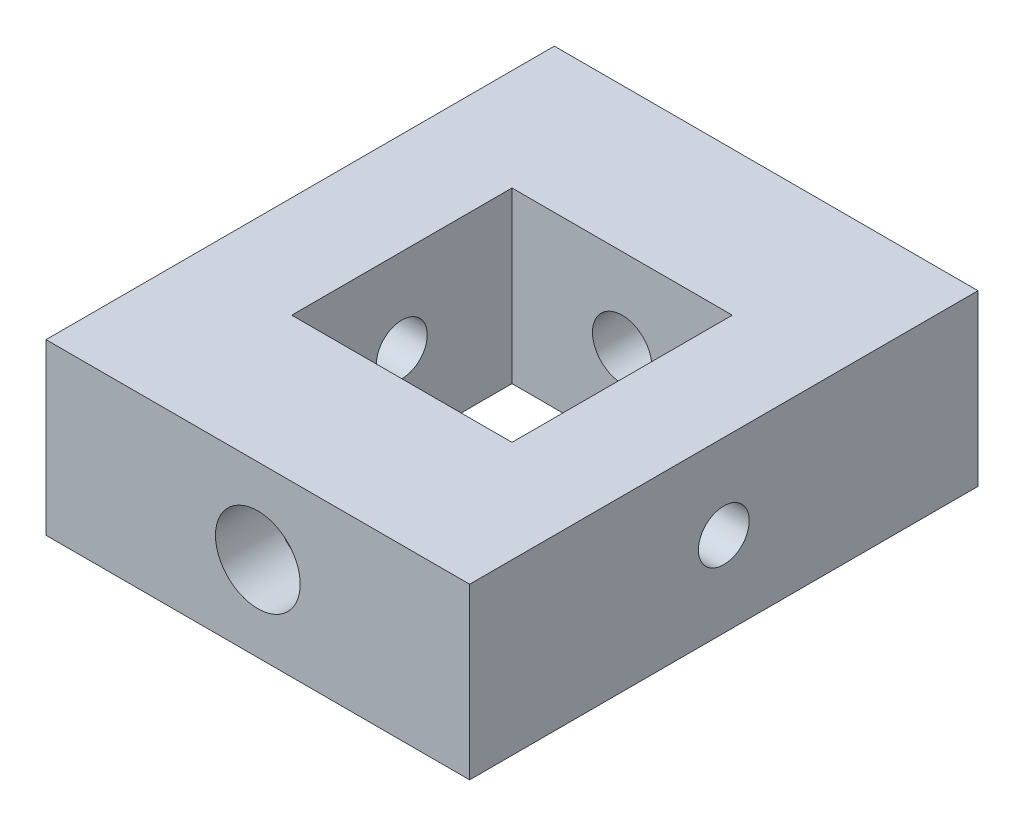
ISO-10303-21;
HEADER;
FILE_DESCRIPTION(('STEP AP214'),'2;1');
FILE_NAME('part.step','',(''),(''),'','','');
FILE_SCHEMA(('AUTOMOTIVE_DESIGN { 1 0 10303 214 1 1 1 1 }'));
ENDSEC;
DATA;
#1=APPLICATION_CONTEXT('core data for automotive mechanical design processes');
#2=APPLICATION_PROTOCOL_DEFINITION('international standard','automotive_design',2000,#1);
#3=PRODUCT_CONTEXT('',#1,'mechanical');
#4=PRODUCT('Part','Part','',(#3));
#5=PRODUCT_RELATED_PRODUCT_CATEGORY('part','',(#4));
#6=PRODUCT_DEFINITION_FORMATION('','',#4);
#7=PRODUCT_DEFINITION_CONTEXT('part definition',#1,'design');
#8=PRODUCT_DEFINITION('design','',#6,#7);
#9=PRODUCT_DEFINITION_SHAPE('','',#8);
#10=(LENGTH_UNIT() NAMED_UNIT(*) SI_UNIT(.MILLI.,.METRE.));
#11=(NAMED_UNIT(*) PLANE_ANGLE_UNIT() SI_UNIT($,.RADIAN.));
#12=(NAMED_UNIT(*) SI_UNIT($,.STERADIAN.) SOLID_ANGLE_UNIT());
#13=UNCERTAINTY_MEASURE_WITH_UNIT(LENGTH_MEASURE(1.E-05),#10,'distance_accuracy_value','');
#14=(GEOMETRIC_REPRESENTATION_CONTEXT(3) GLOBAL_UNCERTAINTY_ASSIGNED_CONTEXT((#13)) GLOBAL_UNIT_ASSIGNED_CONTEXT((#10,
#11,#12)) REPRESENTATION_CONTEXT('',''));
#15=CARTESIAN_POINT('',(0.,0.,0.));
#16=DIRECTION('',(0.,0.,1.));
#17=DIRECTION('',(1.,0.,0.));
#18=AXIS2_PLACEMENT_3D('',#15,#16,#17);
#19=CARTESIAN_POINT('',(2.25514051876985E-13,2.000000000001,6.));
#20=DIRECTION('',(0.,0.,-1.));
#21=DIRECTION('',(-1.,0.,0.));
#22=AXIS2_PLACEMENT_3D('',#19,#20,#21);
#23=CYLINDRICAL_SURFACE('',#22,0.7);
#24=CARTESIAN_POINT('',(2.25514051876985E-13,2.000000000001,-2.6));
#25=DIRECTION('',(0.,0.,-1.));
#26=DIRECTION('',(-1.,0.,0.));
#27=AXIS2_PLACEMENT_3D('',#24,#25,#26);
#28=CIRCLE('',#27,0.7);
#29=CARTESIAN_POINT('',(-0.699999999999774,2.000000000001,-2.6));
#30=VERTEX_POINT('',#29);
#31=EDGE_CURVE('E195',#30,#30,#28,.T.);
#32=ORIENTED_EDGE('',*,*,#31,.F.);
#33=EDGE_LOOP('',(#32));
#34=FACE_BOUND('',#33,.T.);
#35=CARTESIAN_POINT('',(2.25514051876985E-13,2.000000000001,-4.6));
#36=DIRECTION('',(0.,0.,-1.));
#37=DIRECTION('',(-1.,0.,0.));
#38=AXIS2_PLACEMENT_3D('',#35,#36,#37);
#39=CIRCLE('',#38,0.7);
#40=CARTESIAN_POINT('',(-0.699999999999774,2.000000000001,-4.6));
#41=VERTEX_POINT('',#40);
#42=EDGE_CURVE('E198',#41,#41,#39,.F.);
#43=ORIENTED_EDGE('',*,*,#42,.F.);
#44=EDGE_LOOP('',(#43));
#45=FACE_BOUND('',#44,.T.);
#46=ADVANCED_FACE('F61',(#34,#45),#23,.F.);
#47=CARTESIAN_POINT('',(-5.,4.,6.));
#48=DIRECTION('',(-1.,0.,0.));
#49=DIRECTION('',(0.,0.,1.));
#50=AXIS2_PLACEMENT_3D('',#47,#48,#49);
#51=PLANE('',#50);
#52=CARTESIAN_POINT('',(-5.,1.99999999999944,0.));
#53=DIRECTION('',(1.,0.,0.));
#54=DIRECTION('',(0.,0.,-1.));
#55=AXIS2_PLACEMENT_3D('',#52,#53,#54);
#56=CIRCLE('',#55,0.6);
#57=CARTESIAN_POINT('',(-5.,1.99999999999944,-0.599999999999986));
#58=VERTEX_POINT('',#57);
#59=EDGE_CURVE('E194',#58,#58,#56,.T.);
#60=ORIENTED_EDGE('',*,*,#59,.T.);
#61=EDGE_LOOP('',(#60));
#62=FACE_BOUND('',#61,.T.);
#63=DIRECTION('',(0.,0.,-1.));
#64=VECTOR('',#63,1.);
#65=CARTESIAN_POINT('',(-5.,0.,6.));
#66=LINE('',#65,#64);
#67=CARTESIAN_POINT('',(-5.,0.,6.));
#68=VERTEX_POINT('',#67);
#69=CARTESIAN_POINT('',(-5.,0.,-6.));
#70=VERTEX_POINT('',#69);
#71=EDGE_CURVE('E161',#68,#70,#66,.T.);
#72=ORIENTED_EDGE('',*,*,#71,.F.);
#73=DIRECTION('',(0.,-1.,0.));
#74=VECTOR('',#73,1.);
#75=CARTESIAN_POINT('',(-5.,4.,6.));
#76=LINE('',#75,#74);
#77=CARTESIAN_POINT('',(-5.,4.,6.));
#78=VERTEX_POINT('',#77);
#79=EDGE_CURVE('E13',#78,#68,#76,.T.);
#80=ORIENTED_EDGE('',*,*,#79,.F.);
#81=DIRECTION('',(0.,0.,-1.));
#82=VECTOR('',#81,1.);
#83=CARTESIAN_POINT('',(-5.,4.,6.));
#84=LINE('',#83,#82);
#85=CARTESIAN_POINT('',(-5.,4.,-6.));
#86=VERTEX_POINT('',#85);
#87=EDGE_CURVE('E165',#78,#86,#84,.T.);
#88=ORIENTED_EDGE('',*,*,#87,.T.);
#89=DIRECTION('',(0.,-1.,0.));
#90=VECTOR('',#89,1.);
#91=CARTESIAN_POINT('',(-5.,4.,-6.));
#92=LINE('',#91,#90);
#93=EDGE_CURVE('E176',#86,#70,#92,.T.);
#94=ORIENTED_EDGE('',*,*,#93,.T.);
#95=EDGE_LOOP('',(#72,#80,#88,#94));
#96=FACE_BOUND('',#95,.T.);
#97=ADVANCED_FACE('F63',(#62,#96),#51,.T.);
#98=CARTESIAN_POINT('',(-5.,4.,6.));
#99=DIRECTION('',(0.,0.,-1.));
#100=DIRECTION('',(-1.,0.,0.));
#101=AXIS2_PLACEMENT_3D('',#98,#99,#100);
#102=PLANE('',#101);
#103=CARTESIAN_POINT('',(2.25514051876985E-13,2.000000000001,6.));
#104=DIRECTION('',(0.,0.,-1.));
#105=DIRECTION('',(-1.,0.,0.));
#106=AXIS2_PLACEMENT_3D('',#103,#104,#105);
#107=CIRCLE('',#106,1.);
#108=CARTESIAN_POINT('',(-0.999999999999774,2.000000000001,6.));
#109=VERTEX_POINT('',#108);
#110=EDGE_CURVE('E392',#109,#109,#107,.T.);
#111=ORIENTED_EDGE('',*,*,#110,.T.);
#112=EDGE_LOOP('',(#111));
#113=FACE_BOUND('',#112,.T.);
#114=DIRECTION('',(1.,0.,0.));
#115=VECTOR('',#114,1.);
#116=CARTESIAN_POINT('',(-5.,0.,6.));
#117=LINE('',#116,#115);
#118=CARTESIAN_POINT('',(5.,0.,6.));
#119=VERTEX_POINT('',#118);
#120=EDGE_CURVE('E169',#68,#119,#117,.T.);
#121=ORIENTED_EDGE('',*,*,#120,.T.);
#122=DIRECTION('',(0.,-1.,0.));
#123=VECTOR('',#122,1.);
#124=CARTESIAN_POINT('',(5.,4.,6.));
#125=LINE('',#124,#123);
#126=CARTESIAN_POINT('',(5.,4.,6.));
#127=VERTEX_POINT('',#126);
#128=EDGE_CURVE('E70',#127,#119,#125,.T.);
#129=ORIENTED_EDGE('',*,*,#128,.F.);
#130=DIRECTION('',(1.,0.,0.));
#131=VECTOR('',#130,1.);
#132=CARTESIAN_POINT('',(-5.,4.,6.));
#133=LINE('',#132,#131);
#134=EDGE_CURVE('E174',#78,#127,#133,.T.);
#135=ORIENTED_EDGE('',*,*,#134,.F.);
#136=ORIENTED_EDGE('',*,*,#79,.T.);
#137=EDGE_LOOP('',(#121,#129,#135,#136));
#138=FACE_BOUND('',#137,.T.);
#139=ADVANCED_FACE('F225',(#113,#138),#102,.F.);
#140=CARTESIAN_POINT('',(5.,4.,6.));
#141=DIRECTION('',(-1.,0.,0.));
#142=DIRECTION('',(0.,0.,1.));
#143=AXIS2_PLACEMENT_3D('',#140,#141,#142);
#144=PLANE('',#143);
#145=CARTESIAN_POINT('',(5.,1.99999999999944,0.));
#146=DIRECTION('',(1.,0.,0.));
#147=DIRECTION('',(0.,0.,-1.));
#148=AXIS2_PLACEMENT_3D('',#145,#146,#147);
#149=CIRCLE('',#148,0.6);
#150=CARTESIAN_POINT('',(5.,1.99999999999944,-0.599999999999986));
#151=VERTEX_POINT('',#150);
#152=EDGE_CURVE('E214',#151,#151,#149,.T.);
#153=ORIENTED_EDGE('',*,*,#152,.F.);
#154=EDGE_LOOP('',(#153));
#155=FACE_BOUND('',#154,.T.);
#156=DIRECTION('',(0.,0.,-1.));
#157=VECTOR('',#156,1.);
#158=CARTESIAN_POINT('',(5.,0.,6.));
#159=LINE('',#158,#157);
#160=CARTESIAN_POINT('',(5.,0.,-6.));
#161=VERTEX_POINT('',#160);
#162=EDGE_CURVE('E182',#119,#161,#159,.T.);
#163=ORIENTED_EDGE('',*,*,#162,.T.);
#164=DIRECTION('',(0.,-1.,0.));
#165=VECTOR('',#164,1.);
#166=CARTESIAN_POINT('',(5.,4.,-6.));
#167=LINE('',#166,#165);
#168=CARTESIAN_POINT('',(5.,4.,-6.));
#169=VERTEX_POINT('',#168);
#170=EDGE_CURVE('E188',#169,#161,#167,.T.);
#171=ORIENTED_EDGE('',*,*,#170,.F.);
#172=DIRECTION('',(0.,0.,-1.));
#173=VECTOR('',#172,1.);
#174=CARTESIAN_POINT('',(5.,4.,6.));
#175=LINE('',#174,#173);
#176=EDGE_CURVE('E172',#127,#169,#175,.T.);
#177=ORIENTED_EDGE('',*,*,#176,.F.);
#178=ORIENTED_EDGE('',*,*,#128,.T.);
#179=EDGE_LOOP('',(#163,#171,#177,#178));
#180=FACE_BOUND('',#179,.T.);
#181=ADVANCED_FACE('F221',(#155,#180),#144,.F.);
#182=CARTESIAN_POINT('',(-5.,4.,-6.));
#183=DIRECTION('',(0.,0.,-1.));
#184=DIRECTION('',(-1.,0.,0.));
#185=AXIS2_PLACEMENT_3D('',#182,#183,#184);
#186=PLANE('',#185);
#187=CARTESIAN_POINT('',(2.25514051876985E-13,2.000000000001,-6.));
#188=DIRECTION('',(0.,0.,-1.));
#189=DIRECTION('',(-1.,0.,0.));
#190=AXIS2_PLACEMENT_3D('',#187,#188,#189);
#191=CIRCLE('',#190,1.);
#192=CARTESIAN_POINT('',(-0.999999999999774,2.000000000001,-6.));
#193=VERTEX_POINT('',#192);
#194=EDGE_CURVE('E204',#193,#193,#191,.T.);
#195=ORIENTED_EDGE('',*,*,#194,.F.);
#196=EDGE_LOOP('',(#195));
#197=FACE_BOUND('',#196,.T.);
#198=DIRECTION('',(1.,0.,0.));
#199=VECTOR('',#198,1.);
#200=CARTESIAN_POINT('',(-5.,0.,-6.));
#201=LINE('',#200,#199);
#202=EDGE_CURVE('E179',#70,#161,#201,.T.);
#203=ORIENTED_EDGE('',*,*,#202,.F.);
#204=ORIENTED_EDGE('',*,*,#93,.F.);
#205=DIRECTION('',(1.,0.,0.));
#206=VECTOR('',#205,1.);
#207=CARTESIAN_POINT('',(-5.,4.,-6.));
#208=LINE('',#207,#206);
#209=EDGE_CURVE('E168',#86,#169,#208,.T.);
#210=ORIENTED_EDGE('',*,*,#209,.T.);
#211=ORIENTED_EDGE('',*,*,#170,.T.);
#212=EDGE_LOOP('',(#203,#204,#210,#211));
#213=FACE_BOUND('',#212,.T.);
#214=ADVANCED_FACE('F224',(#197,#213),#186,.T.);
#215=CARTESIAN_POINT('',(0.,4.,0.));
#216=DIRECTION('',(0.,-1.,0.));
#217=DIRECTION('',(0.,0.,-1.));
#218=AXIS2_PLACEMENT_3D('',#215,#216,#217);
#219=PLANE('',#218);
#220=DIRECTION('',(1.,0.,0.));
#221=VECTOR('',#220,1.);
#222=CARTESIAN_POINT('',(-2.6,4.,2.6));
#223=LINE('',#222,#221);
#224=CARTESIAN_POINT('',(-2.6,4.,2.6));
#225=VERTEX_POINT('',#224);
#226=CARTESIAN_POINT('',(2.6,4.,2.6));
#227=VERTEX_POINT('',#226);
#228=EDGE_CURVE('E132',#225,#227,#223,.T.);
#229=ORIENTED_EDGE('',*,*,#228,.F.);
#230=DIRECTION('',(0.,0.,-1.));
#231=VECTOR('',#230,1.);
#232=CARTESIAN_POINT('',(-2.6,4.,2.6));
#233=LINE('',#232,#231);
#234=CARTESIAN_POINT('',(-2.6,4.,-2.6));
#235=VERTEX_POINT('',#234);
#236=EDGE_CURVE('E129',#225,#235,#233,.T.);
#237=ORIENTED_EDGE('',*,*,#236,.T.);
#238=DIRECTION('',(1.,0.,0.));
#239=VECTOR('',#238,1.);
#240=CARTESIAN_POINT('',(-2.6,4.,-2.6));
#241=LINE('',#240,#239);
#242=CARTESIAN_POINT('',(2.6,4.,-2.6));
#243=VERTEX_POINT('',#242);
#244=EDGE_CURVE('E135',#235,#243,#241,.T.);
#245=ORIENTED_EDGE('',*,*,#244,.T.);
#246=DIRECTION('',(0.,0.,-1.));
#247=VECTOR('',#246,1.);
#248=CARTESIAN_POINT('',(2.6,4.,2.6));
#249=LINE('',#248,#247);
#250=EDGE_CURVE('E139',#227,#243,#249,.T.);
#251=ORIENTED_EDGE('',*,*,#250,.F.);
#252=EDGE_LOOP('',(#229,#237,#245,#251));
#253=FACE_BOUND('',#252,.T.);
#254=ORIENTED_EDGE('',*,*,#87,.F.);
#255=ORIENTED_EDGE('',*,*,#134,.T.);
#256=ORIENTED_EDGE('',*,*,#176,.T.);
#257=ORIENTED_EDGE('',*,*,#209,.F.);
#258=EDGE_LOOP('',(#254,#255,#256,#257));
#259=FACE_BOUND('',#258,.T.);
#260=ADVANCED_FACE('F141',(#253,#259),#219,.F.);
#261=CARTESIAN_POINT('',(0.,0.,0.));
#262=DIRECTION('',(0.,-1.,0.));
#263=DIRECTION('',(0.,0.,-1.));
#264=AXIS2_PLACEMENT_3D('',#261,#262,#263);
#265=PLANE('',#264);
#266=DIRECTION('',(0.,0.,-1.));
#267=VECTOR('',#266,1.);
#268=CARTESIAN_POINT('',(-2.6,0.,2.6));
#269=LINE('',#268,#267);
#270=CARTESIAN_POINT('',(-2.6,0.,2.6));
#271=VERTEX_POINT('',#270);
#272=CARTESIAN_POINT('',(-2.6,0.,-2.6));
#273=VERTEX_POINT('',#272);
#274=EDGE_CURVE('E86',#271,#273,#269,.T.);
#275=ORIENTED_EDGE('',*,*,#274,.F.);
#276=DIRECTION('',(1.,0.,0.));
#277=VECTOR('',#276,1.);
#278=CARTESIAN_POINT('',(-2.6,0.,2.6));
#279=LINE('',#278,#277);
#280=CARTESIAN_POINT('',(2.6,0.,2.6));
#281=VERTEX_POINT('',#280);
#282=EDGE_CURVE('E143',#271,#281,#279,.T.);
#283=ORIENTED_EDGE('',*,*,#282,.T.);
#284=DIRECTION('',(0.,0.,-1.));
#285=VECTOR('',#284,1.);
#286=CARTESIAN_POINT('',(2.6,0.,2.6));
#287=LINE('',#286,#285);
#288=CARTESIAN_POINT('',(2.6,0.,-2.6));
#289=VERTEX_POINT('',#288);
#290=EDGE_CURVE('E146',#281,#289,#287,.T.);
#291=ORIENTED_EDGE('',*,*,#290,.T.);
#292=DIRECTION('',(1.,0.,0.));
#293=VECTOR('',#292,1.);
#294=CARTESIAN_POINT('',(-2.6,0.,-2.6));
#295=LINE('',#294,#293);
#296=EDGE_CURVE('E155',#273,#289,#295,.T.);
#297=ORIENTED_EDGE('',*,*,#296,.F.);
#298=EDGE_LOOP('',(#275,#283,#291,#297));
#299=FACE_BOUND('',#298,.T.);
#300=ORIENTED_EDGE('',*,*,#71,.T.);
#301=ORIENTED_EDGE('',*,*,#202,.T.);
#302=ORIENTED_EDGE('',*,*,#162,.F.);
#303=ORIENTED_EDGE('',*,*,#120,.F.);
#304=EDGE_LOOP('',(#300,#301,#302,#303));
#305=FACE_BOUND('',#304,.T.);
#306=ADVANCED_FACE('F234',(#299,#305),#265,.T.);
#307=CARTESIAN_POINT('',(-2.6,4.,2.6));
#308=DIRECTION('',(-1.,0.,0.));
#309=DIRECTION('',(0.,0.,1.));
#310=AXIS2_PLACEMENT_3D('',#307,#308,#309);
#311=PLANE('',#310);
#312=CARTESIAN_POINT('',(-2.6,1.99999999999944,0.));
#313=DIRECTION('',(-1.,0.,0.));
#314=DIRECTION('',(0.,0.,1.));
#315=AXIS2_PLACEMENT_3D('',#312,#313,#314);
#316=CIRCLE('',#315,0.6);
#317=CARTESIAN_POINT('',(-2.6,1.99999999999944,0.600000000000013));
#318=VERTEX_POINT('',#317);
#319=EDGE_CURVE('E149',#318,#318,#316,.T.);
#320=ORIENTED_EDGE('',*,*,#319,.T.);
#321=EDGE_LOOP('',(#320));
#322=FACE_BOUND('',#321,.T.);
#323=ORIENTED_EDGE('',*,*,#274,.T.);
#324=DIRECTION('',(0.,-1.,0.));
#325=VECTOR('',#324,1.);
#326=CARTESIAN_POINT('',(-2.6,4.,-2.6));
#327=LINE('',#326,#325);
#328=EDGE_CURVE('E126',#235,#273,#327,.T.);
#329=ORIENTED_EDGE('',*,*,#328,.F.);
#330=ORIENTED_EDGE('',*,*,#236,.F.);
#331=DIRECTION('',(0.,-1.,0.));
#332=VECTOR('',#331,1.);
#333=CARTESIAN_POINT('',(-2.6,4.,2.6));
#334=LINE('',#333,#332);
#335=EDGE_CURVE('E159',#225,#271,#334,.T.);
#336=ORIENTED_EDGE('',*,*,#335,.T.);
#337=EDGE_LOOP('',(#323,#329,#330,#336));
#338=FACE_BOUND('',#337,.T.);
#339=ADVANCED_FACE('F127',(#322,#338),#311,.F.);
#340=CARTESIAN_POINT('',(-2.6,4.,2.6));
#341=DIRECTION('',(0.,0.,-1.));
#342=DIRECTION('',(-1.,0.,0.));
#343=AXIS2_PLACEMENT_3D('',#340,#341,#342);
#344=PLANE('',#343);
#345=CARTESIAN_POINT('',(2.25514051876985E-13,2.000000000001,2.6));
#346=DIRECTION('',(0.,0.,-1.));
#347=DIRECTION('',(-1.,0.,0.));
#348=AXIS2_PLACEMENT_3D('',#345,#346,#347);
#349=CIRCLE('',#348,0.7);
#350=CARTESIAN_POINT('',(-0.699999999999774,2.000000000001,2.6));
#351=VERTEX_POINT('',#350);
#352=EDGE_CURVE('E197',#351,#351,#349,.T.);
#353=ORIENTED_EDGE('',*,*,#352,.F.);
#354=EDGE_LOOP('',(#353));
#355=FACE_BOUND('',#354,.T.);
#356=ORIENTED_EDGE('',*,*,#282,.F.);
#357=ORIENTED_EDGE('',*,*,#335,.F.);
#358=ORIENTED_EDGE('',*,*,#228,.T.);
#359=DIRECTION('',(0.,-1.,0.));
#360=VECTOR('',#359,1.);
#361=CARTESIAN_POINT('',(2.6,4.,2.6));
#362=LINE('',#361,#360);
#363=EDGE_CURVE('E162',#227,#281,#362,.T.);
#364=ORIENTED_EDGE('',*,*,#363,.T.);
#365=EDGE_LOOP('',(#356,#357,#358,#364));
#366=FACE_BOUND('',#365,.T.);
#367=ADVANCED_FACE('F278',(#355,#366),#344,.T.);
#368=CARTESIAN_POINT('',(2.6,4.,2.6));
#369=DIRECTION('',(-1.,0.,0.));
#370=DIRECTION('',(0.,0.,1.));
#371=AXIS2_PLACEMENT_3D('',#368,#369,#370);
#372=PLANE('',#371);
#373=CARTESIAN_POINT('',(2.6,1.99999999999944,0.));
#374=DIRECTION('',(-1.,0.,0.));
#375=DIRECTION('',(0.,0.,1.));
#376=AXIS2_PLACEMENT_3D('',#373,#374,#375);
#377=CIRCLE('',#376,0.6);
#378=CARTESIAN_POINT('',(2.6,1.99999999999944,0.600000000000013));
#379=VERTEX_POINT('',#378);
#380=EDGE_CURVE('E191',#379,#379,#377,.T.);
#381=ORIENTED_EDGE('',*,*,#380,.F.);
#382=EDGE_LOOP('',(#381));
#383=FACE_BOUND('',#382,.T.);
#384=ORIENTED_EDGE('',*,*,#290,.F.);
#385=ORIENTED_EDGE('',*,*,#363,.F.);
#386=ORIENTED_EDGE('',*,*,#250,.T.);
#387=DIRECTION('',(0.,-1.,0.));
#388=VECTOR('',#387,1.);
#389=CARTESIAN_POINT('',(2.6,4.,-2.6));
#390=LINE('',#389,#388);
#391=EDGE_CURVE('E78',#243,#289,#390,.T.);
#392=ORIENTED_EDGE('',*,*,#391,.T.);
#393=EDGE_LOOP('',(#384,#385,#386,#392));
#394=FACE_BOUND('',#393,.T.);
#395=ADVANCED_FACE('F281',(#383,#394),#372,.T.);
#396=CARTESIAN_POINT('',(-2.6,4.,-2.6));
#397=DIRECTION('',(0.,0.,-1.));
#398=DIRECTION('',(-1.,0.,0.));
#399=AXIS2_PLACEMENT_3D('',#396,#397,#398);
#400=PLANE('',#399);
#401=ORIENTED_EDGE('',*,*,#31,.T.);
#402=EDGE_LOOP('',(#401));
#403=FACE_BOUND('',#402,.T.);
#404=ORIENTED_EDGE('',*,*,#296,.T.);
#405=ORIENTED_EDGE('',*,*,#391,.F.);
#406=ORIENTED_EDGE('',*,*,#244,.F.);
#407=ORIENTED_EDGE('',*,*,#328,.T.);
#408=EDGE_LOOP('',(#404,#405,#406,#407));
#409=FACE_BOUND('',#408,.T.);
#410=ADVANCED_FACE('F136',(#403,#409),#400,.F.);
#411=CARTESIAN_POINT('',(-5.,1.99999999999944,0.));
#412=DIRECTION('',(1.,0.,0.));
#413=DIRECTION('',(0.,0.,-1.));
#414=AXIS2_PLACEMENT_3D('',#411,#412,#413);
#415=CYLINDRICAL_SURFACE('',#414,0.6);
#416=ORIENTED_EDGE('',*,*,#380,.T.);
#417=EDGE_LOOP('',(#416));
#418=FACE_BOUND('',#417,.T.);
#419=ORIENTED_EDGE('',*,*,#152,.T.);
#420=EDGE_LOOP('',(#419));
#421=FACE_BOUND('',#420,.T.);
#422=ADVANCED_FACE('F219',(#418,#421),#415,.F.);
#423=ORIENTED_EDGE('',*,*,#59,.F.);
#424=EDGE_LOOP('',(#423));
#425=FACE_BOUND('',#424,.T.);
#426=ORIENTED_EDGE('',*,*,#319,.F.);
#427=EDGE_LOOP('',(#426));
#428=FACE_BOUND('',#427,.T.);
#429=ADVANCED_FACE('F263',(#425,#428),#415,.F.);
#430=CARTESIAN_POINT('',(2.25514051876985E-13,2.000000000001,4.6));
#431=DIRECTION('',(0.,0.,-1.));
#432=DIRECTION('',(-1.,0.,0.));
#433=AXIS2_PLACEMENT_3D('',#430,#431,#432);
#434=CIRCLE('',#433,0.7);
#435=CARTESIAN_POINT('',(-0.699999999999774,2.000000000001,4.6));
#436=VERTEX_POINT('',#435);
#437=EDGE_CURVE('E65',#436,#436,#434,.F.);
#438=ORIENTED_EDGE('',*,*,#437,.T.);
#439=EDGE_LOOP('',(#438));
#440=FACE_BOUND('',#439,.T.);
#441=ORIENTED_EDGE('',*,*,#352,.T.);
#442=EDGE_LOOP('',(#441));
#443=FACE_BOUND('',#442,.T.);
#444=ADVANCED_FACE('F254',(#440,#443),#23,.F.);
#445=CARTESIAN_POINT('',(-2.6,4.,-4.6));
#446=DIRECTION('',(0.,0.,-1.));
#447=DIRECTION('',(-1.,0.,0.));
#448=AXIS2_PLACEMENT_3D('',#445,#446,#447);
#449=PLANE('',#448);
#450=CARTESIAN_POINT('',(2.25514051876985E-13,2.000000000001,-4.6));
#451=DIRECTION('',(0.,0.,-1.));
#452=DIRECTION('',(-1.,0.,0.));
#453=AXIS2_PLACEMENT_3D('',#450,#451,#452);
#454=CIRCLE('',#453,1.);
#455=CARTESIAN_POINT('',(-0.999999999999774,2.000000000001,-4.6));
#456=VERTEX_POINT('',#455);
#457=EDGE_CURVE('E200',#456,#456,#454,.F.);
#458=ORIENTED_EDGE('',*,*,#457,.F.);
#459=EDGE_LOOP('',(#458));
#460=FACE_BOUND('',#459,.T.);
#461=ORIENTED_EDGE('',*,*,#42,.T.);
#462=EDGE_LOOP('',(#461));
#463=FACE_BOUND('',#462,.T.);
#464=ADVANCED_FACE('F262',(#460,#463),#449,.T.);
#465=CARTESIAN_POINT('',(2.25514051876985E-13,2.000000000001,0.228427124746189));
#466=DIRECTION('',(0.,0.,-1.));
#467=DIRECTION('',(-1.,0.,0.));
#468=AXIS2_PLACEMENT_3D('',#465,#466,#467);
#469=CYLINDRICAL_SURFACE('',#468,1.);
#470=CARTESIAN_POINT('',(-0.999999999999774,2.000000000001,-4.6));
#471=CARTESIAN_POINT('',(-0.999999999999774,2.000000000001,-4.61458333333333));
#472=CARTESIAN_POINT('',(-0.999999999999774,2.000000000001,-4.62916666666667));
#473=CARTESIAN_POINT('',(-0.999999999999774,2.000000000001,-4.65833333333333));
#474=CARTESIAN_POINT('',(-0.999999999999774,2.000000000001,-4.67291666666667));
#475=CARTESIAN_POINT('',(-0.999999999999774,2.000000000001,-4.70208333333333));
#476=CARTESIAN_POINT('',(-0.999999999999774,2.000000000001,-4.71666666666667));
#477=CARTESIAN_POINT('',(-0.999999999999774,2.000000000001,-4.74583333333333));
#478=CARTESIAN_POINT('',(-0.999999999999774,2.000000000001,-4.76041666666667));
#479=CARTESIAN_POINT('',(-0.999999999999774,2.000000000001,-4.78958333333333));
#480=CARTESIAN_POINT('',(-0.999999999999774,2.000000000001,-4.80416666666667));
#481=CARTESIAN_POINT('',(-0.999999999999774,2.000000000001,-4.83333333333333));
#482=CARTESIAN_POINT('',(-0.999999999999774,2.000000000001,-4.84791666666667));
#483=CARTESIAN_POINT('',(-0.999999999999774,2.000000000001,-4.87708333333333));
#484=CARTESIAN_POINT('',(-0.999999999999774,2.000000000001,-4.89166666666667));
#485=CARTESIAN_POINT('',(-0.999999999999774,2.000000000001,-4.92083333333333));
#486=CARTESIAN_POINT('',(-0.999999999999774,2.000000000001,-4.93541666666667));
#487=CARTESIAN_POINT('',(-0.999999999999774,2.000000000001,-4.96458333333333));
#488=CARTESIAN_POINT('',(-0.999999999999774,2.000000000001,-4.97916666666667));
#489=CARTESIAN_POINT('',(-0.999999999999774,2.000000000001,-5.00833333333333));
#490=CARTESIAN_POINT('',(-0.999999999999774,2.000000000001,-5.02291666666667));
#491=CARTESIAN_POINT('',(-0.999999999999774,2.000000000001,-5.05208333333333));
#492=CARTESIAN_POINT('',(-0.999999999999774,2.000000000001,-5.06666666666667));
#493=CARTESIAN_POINT('',(-0.999999999999774,2.000000000001,-5.09583333333333));
#494=CARTESIAN_POINT('',(-0.999999999999774,2.000000000001,-5.11041666666667));
#495=CARTESIAN_POINT('',(-0.999999999999774,2.000000000001,-5.13958333333333));
#496=CARTESIAN_POINT('',(-0.999999999999774,2.000000000001,-5.15416666666667));
#497=CARTESIAN_POINT('',(-0.999999999999774,2.000000000001,-5.18333333333333));
#498=CARTESIAN_POINT('',(-0.999999999999774,2.000000000001,-5.19791666666667));
#499=CARTESIAN_POINT('',(-0.999999999999774,2.000000000001,-5.22708333333333));
#500=CARTESIAN_POINT('',(-0.999999999999774,2.000000000001,-5.24166666666667));
#501=CARTESIAN_POINT('',(-0.999999999999774,2.000000000001,-5.27083333333333));
#502=CARTESIAN_POINT('',(-0.999999999999774,2.000000000001,-5.28541666666667));
#503=CARTESIAN_POINT('',(-0.999999999999774,2.000000000001,-5.31458333333333));
#504=CARTESIAN_POINT('',(-0.999999999999774,2.000000000001,-5.32916666666666));
#505=CARTESIAN_POINT('',(-0.999999999999774,2.000000000001,-5.35833333333333));
#506=CARTESIAN_POINT('',(-0.999999999999774,2.000000000001,-5.37291666666667));
#507=CARTESIAN_POINT('',(-0.999999999999774,2.000000000001,-5.40208333333333));
#508=CARTESIAN_POINT('',(-0.999999999999774,2.000000000001,-5.41666666666667));
#509=CARTESIAN_POINT('',(-0.999999999999774,2.000000000001,-5.44583333333333));
#510=CARTESIAN_POINT('',(-0.999999999999774,2.000000000001,-5.46041666666667));
#511=CARTESIAN_POINT('',(-0.999999999999774,2.000000000001,-5.48958333333333));
#512=CARTESIAN_POINT('',(-0.999999999999774,2.000000000001,-5.50416666666667));
#513=CARTESIAN_POINT('',(-0.999999999999774,2.000000000001,-5.53333333333333));
#514=CARTESIAN_POINT('',(-0.999999999999774,2.000000000001,-5.54791666666667));
#515=CARTESIAN_POINT('',(-0.999999999999774,2.000000000001,-5.57708333333333));
#516=CARTESIAN_POINT('',(-0.999999999999774,2.000000000001,-5.59166666666667));
#517=CARTESIAN_POINT('',(-0.999999999999774,2.000000000001,-5.62083333333333));
#518=CARTESIAN_POINT('',(-0.999999999999774,2.000000000001,-5.63541666666667));
#519=CARTESIAN_POINT('',(-0.999999999999774,2.000000000001,-5.66458333333333));
#520=CARTESIAN_POINT('',(-0.999999999999774,2.000000000001,-5.67916666666667));
#521=CARTESIAN_POINT('',(-0.999999999999774,2.000000000001,-5.70833333333333));
#522=CARTESIAN_POINT('',(-0.999999999999774,2.000000000001,-5.72291666666667));
#523=CARTESIAN_POINT('',(-0.999999999999774,2.000000000001,-5.75208333333333));
#524=CARTESIAN_POINT('',(-0.999999999999774,2.000000000001,-5.76666666666667));
#525=CARTESIAN_POINT('',(-0.999999999999774,2.000000000001,-5.79583333333333));
#526=CARTESIAN_POINT('',(-0.999999999999774,2.000000000001,-5.81041666666667));
#527=CARTESIAN_POINT('',(-0.999999999999774,2.000000000001,-5.83958333333333));
#528=CARTESIAN_POINT('',(-0.999999999999774,2.000000000001,-5.85416666666667));
#529=CARTESIAN_POINT('',(-0.999999999999774,2.000000000001,-5.88333333333333));
#530=CARTESIAN_POINT('',(-0.999999999999774,2.000000000001,-5.89791666666667));
#531=CARTESIAN_POINT('',(-0.999999999999774,2.000000000001,-5.92708333333333));
#532=CARTESIAN_POINT('',(-0.999999999999774,2.000000000001,-5.94166666666667));
#533=CARTESIAN_POINT('',(-0.999999999999774,2.000000000001,-5.97083333333333));
#534=CARTESIAN_POINT('',(-0.999999999999774,2.000000000001,-5.98541666666667));
#535=CARTESIAN_POINT('',(-0.999999999999774,2.000000000001,-6.));
#536=B_SPLINE_CURVE_WITH_KNOTS('',3,(#470,#471,#472,#473,#474,#475,#476,#477,#478,#479,#480,
#481,#482,#483,#484,#485,#486,#487,#488,#489,#490,#491,#492,#493,#494,#495,#496,#497,#498,#499,
#500,#501,#502,#503,#504,#505,#506,#507,#508,#509,#510,#511,#512,#513,#514,#515,#516,#517,#518,
#519,#520,#521,#522,#523,#524,#525,#526,#527,#528,#529,#530,#531,#532,#533,#534,#535),
.UNSPECIFIED.,.F.,.F.,(4,2,2,2,2,2,2,2,2,2,2,2,2,2,2,2,2,2,2,2,2,2,2,2,2,2,2,2,2,2,2,2,4),(0.,
0.0437500000000004,0.0874999999999999,0.13125,0.175,0.21875,0.2625,0.30625,0.35,0.39375,0.4375,
0.48125,0.525,0.56875,0.6125,0.656250000000001,0.7,0.74375,0.7875,0.83125,0.875,0.91875,0.9625,
1.00625,1.05,1.09375,1.1375,1.18125,1.225,1.26875,1.3125,1.35625,1.4),.UNSPECIFIED.);
#537=EDGE_CURVE('BSEAM269',#456,#193,#536,.T.);
#538=ORIENTED_EDGE('',*,*,#457,.T.);
#539=ORIENTED_EDGE('',*,*,#194,.T.);
#540=ORIENTED_EDGE('',*,*,#537,.T.);
#541=ORIENTED_EDGE('',*,*,#537,.F.);
#542=EDGE_LOOP('',(#538,#540,#539,#541));
#543=FACE_BOUND('',#542,.T.);
#544=ADVANCED_FACE('F269',(#543),#469,.F.);
#545=CARTESIAN_POINT('',(-2.6,4.,4.6));
#546=DIRECTION('',(0.,0.,-1.));
#547=DIRECTION('',(-1.,0.,0.));
#548=AXIS2_PLACEMENT_3D('',#545,#546,#547);
#549=PLANE('',#548);
#550=CARTESIAN_POINT('',(2.25514051876985E-13,2.000000000001,4.6));
#551=DIRECTION('',(0.,0.,-1.));
#552=DIRECTION('',(-1.,0.,0.));
#553=AXIS2_PLACEMENT_3D('',#550,#551,#552);
#554=CIRCLE('',#553,1.);
#555=CARTESIAN_POINT('',(-0.999999999999774,2.000000000001,4.6));
#556=VERTEX_POINT('',#555);
#557=EDGE_CURVE('E395',#556,#556,#554,.T.);
#558=ORIENTED_EDGE('',*,*,#557,.F.);
#559=EDGE_LOOP('',(#558));
#560=FACE_BOUND('',#559,.T.);
#561=ORIENTED_EDGE('',*,*,#437,.F.);
#562=EDGE_LOOP('',(#561));
#563=FACE_BOUND('',#562,.T.);
#564=ADVANCED_FACE('F359',(#560,#563),#549,.F.);
#565=CARTESIAN_POINT('',(2.25514051876985E-13,2.000000000001,-0.228427124746188));
#566=DIRECTION('',(0.,0.,1.));
#567=DIRECTION('',(1.,0.,0.));
#568=AXIS2_PLACEMENT_3D('',#565,#566,#567);
#569=CYLINDRICAL_SURFACE('',#568,1.);
#570=ORIENTED_EDGE('',*,*,#110,.F.);
#571=EDGE_LOOP('',(#570));
#572=FACE_BOUND('',#571,.T.);
#573=ORIENTED_EDGE('',*,*,#557,.T.);
#574=EDGE_LOOP('',(#573));
#575=FACE_BOUND('',#574,.T.);
#576=ADVANCED_FACE('F376',(#572,#575),#569,.F.);
#577=CLOSED_SHELL('',(#46,#97,#139,#181,#214,#260,#306,#339,#367,#395,#410,#422,#429,#444,#464,
#544,#564,#576));
#578=MANIFOLD_SOLID_BREP('B2',#577);
#579=ADVANCED_BREP_SHAPE_REPRESENTATION('',(#18,#578),#14);
#580=SHAPE_DEFINITION_REPRESENTATION(#9,#579);
ENDSEC;
END-ISO-10303-21;
